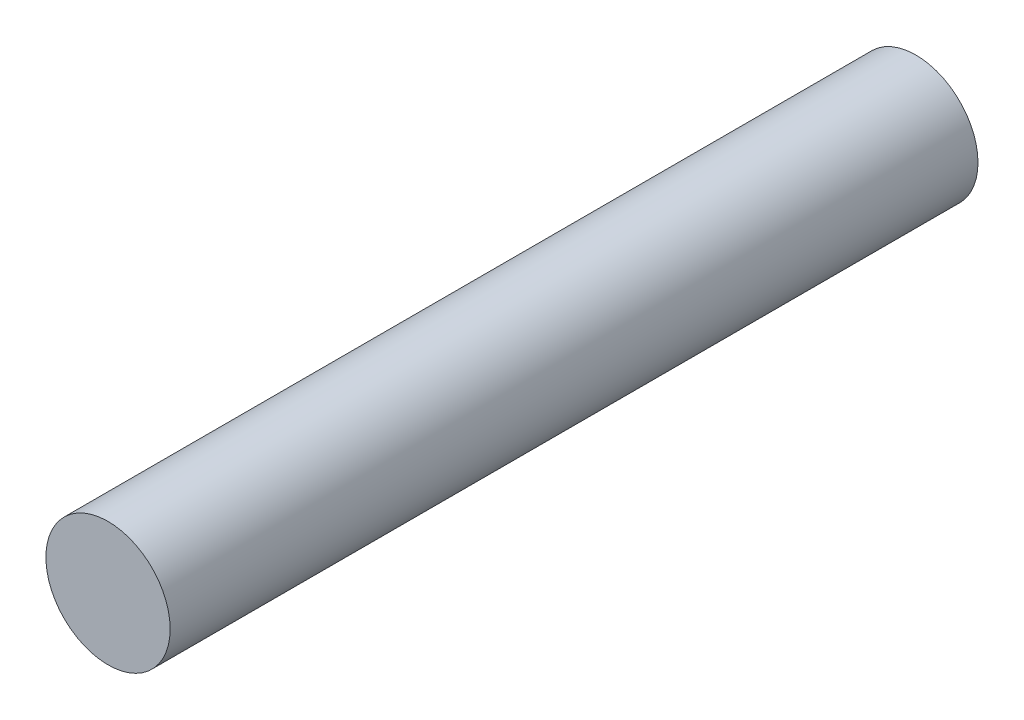
ISO-10303-21;
HEADER;
FILE_DESCRIPTION(('STEP AP214'),'2;1');
FILE_NAME('part.step','',(''),(''),'','','');
FILE_SCHEMA(('AUTOMOTIVE_DESIGN { 1 0 10303 214 1 1 1 1 }'));
ENDSEC;
DATA;
#1=APPLICATION_CONTEXT('core data for automotive mechanical design processes');
#2=APPLICATION_PROTOCOL_DEFINITION('international standard','automotive_design',2000,#1);
#3=PRODUCT_CONTEXT('',#1,'mechanical');
#4=PRODUCT('Part','Part','',(#3));
#5=PRODUCT_RELATED_PRODUCT_CATEGORY('part','',(#4));
#6=PRODUCT_DEFINITION_FORMATION('','',#4);
#7=PRODUCT_DEFINITION_CONTEXT('part definition',#1,'design');
#8=PRODUCT_DEFINITION('design','',#6,#7);
#9=PRODUCT_DEFINITION_SHAPE('','',#8);
#10=(LENGTH_UNIT() NAMED_UNIT(*) SI_UNIT(.MILLI.,.METRE.));
#11=(NAMED_UNIT(*) PLANE_ANGLE_UNIT() SI_UNIT($,.RADIAN.));
#12=(NAMED_UNIT(*) SI_UNIT($,.STERADIAN.) SOLID_ANGLE_UNIT());
#13=UNCERTAINTY_MEASURE_WITH_UNIT(LENGTH_MEASURE(1.E-05),#10,'distance_accuracy_value','');
#14=(GEOMETRIC_REPRESENTATION_CONTEXT(3) GLOBAL_UNCERTAINTY_ASSIGNED_CONTEXT((#13)) GLOBAL_UNIT_ASSIGNED_CONTEXT((#10,
#11,#12)) REPRESENTATION_CONTEXT('',''));
#15=CARTESIAN_POINT('',(0.,0.,0.));
#16=DIRECTION('',(0.,0.,1.));
#17=DIRECTION('',(1.,0.,0.));
#18=AXIS2_PLACEMENT_3D('',#15,#16,#17);
#19=CARTESIAN_POINT('',(0.,0.,130.));
#20=DIRECTION('',(0.,0.,-1.));
#21=DIRECTION('',(-1.,0.,0.));
#22=AXIS2_PLACEMENT_3D('',#19,#20,#21);
#23=CYLINDRICAL_SURFACE('',#22,10.);
#24=CARTESIAN_POINT('',(0.,0.,130.));
#25=DIRECTION('',(0.,0.,1.));
#26=DIRECTION('',(1.,0.,0.));
#27=AXIS2_PLACEMENT_3D('',#24,#25,#26);
#28=CIRCLE('',#27,10.);
#29=CARTESIAN_POINT('',(10.,0.,130.));
#30=VERTEX_POINT('',#29);
#31=EDGE_CURVE('E10',#30,#30,#28,.T.);
#32=ORIENTED_EDGE('',*,*,#31,.F.);
#33=EDGE_LOOP('',(#32));
#34=FACE_BOUND('',#33,.T.);
#35=CARTESIAN_POINT('',(0.,0.,0.));
#36=DIRECTION('',(0.,0.,1.));
#37=DIRECTION('',(1.,0.,0.));
#38=AXIS2_PLACEMENT_3D('',#35,#36,#37);
#39=CIRCLE('',#38,10.);
#40=CARTESIAN_POINT('',(10.,0.,0.));
#41=VERTEX_POINT('',#40);
#42=EDGE_CURVE('E40',#41,#41,#39,.T.);
#43=ORIENTED_EDGE('',*,*,#42,.T.);
#44=EDGE_LOOP('',(#43));
#45=FACE_BOUND('',#44,.T.);
#46=ADVANCED_FACE('F37',(#34,#45),#23,.T.);
#47=CARTESIAN_POINT('',(0.,0.,130.));
#48=DIRECTION('',(0.,0.,1.));
#49=DIRECTION('',(1.,0.,0.));
#50=AXIS2_PLACEMENT_3D('',#47,#48,#49);
#51=PLANE('',#50);
#52=ORIENTED_EDGE('',*,*,#31,.T.);
#53=EDGE_LOOP('',(#52));
#54=FACE_BOUND('',#53,.T.);
#55=ADVANCED_FACE('F52',(#54),#51,.T.);
#56=CARTESIAN_POINT('',(0.,0.,0.));
#57=DIRECTION('',(0.,0.,1.));
#58=DIRECTION('',(1.,0.,0.));
#59=AXIS2_PLACEMENT_3D('',#56,#57,#58);
#60=PLANE('',#59);
#61=ORIENTED_EDGE('',*,*,#42,.F.);
#62=EDGE_LOOP('',(#61));
#63=FACE_BOUND('',#62,.T.);
#64=ADVANCED_FACE('F50',(#63),#60,.F.);
#65=CLOSED_SHELL('',(#46,#55,#64));
#66=MANIFOLD_SOLID_BREP('B2',#65);
#67=ADVANCED_BREP_SHAPE_REPRESENTATION('',(#18,#66),#14);
#68=SHAPE_DEFINITION_REPRESENTATION(#9,#67);
ENDSEC;
END-ISO-10303-21;
